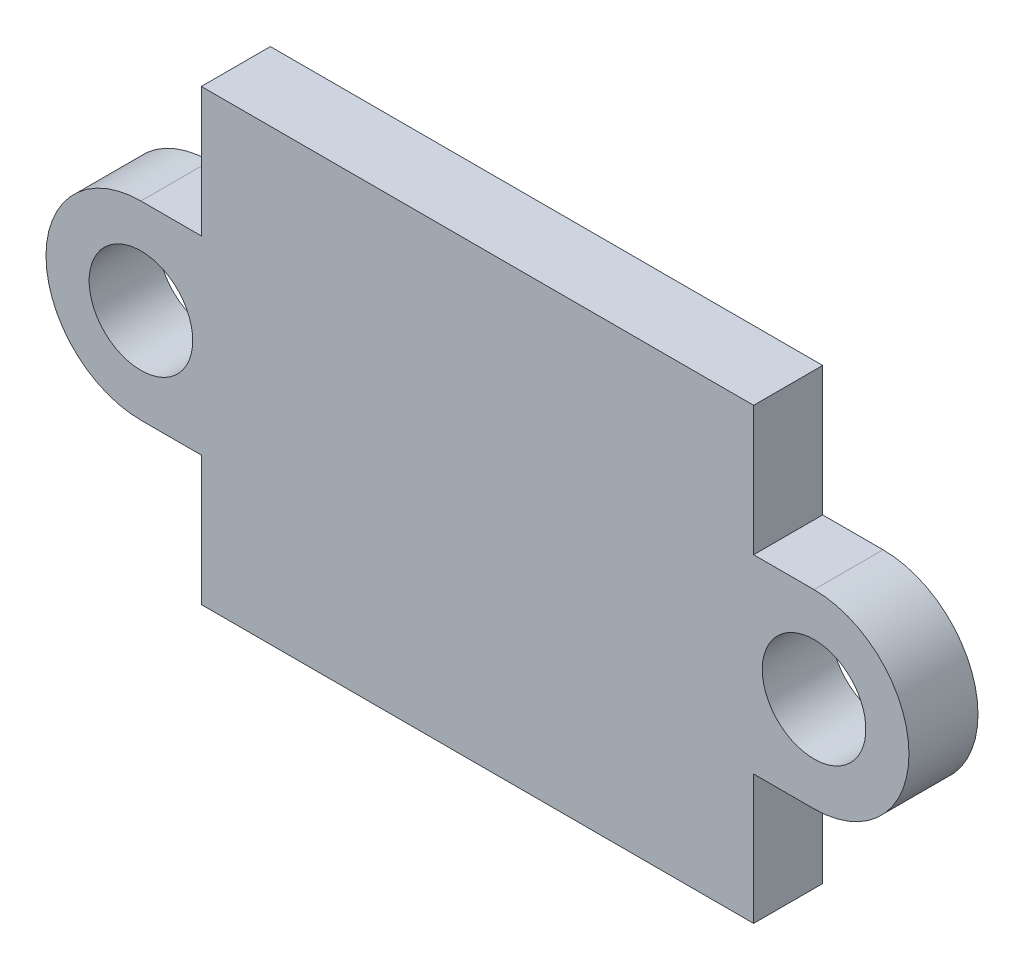
ISO-10303-21;
HEADER;
FILE_DESCRIPTION(('STEP AP214'),'2;1');
FILE_NAME('part.step','',(''),(''),'','','');
FILE_SCHEMA(('AUTOMOTIVE_DESIGN { 1 0 10303 214 1 1 1 1 }'));
ENDSEC;
DATA;
#1=APPLICATION_CONTEXT('core data for automotive mechanical design processes');
#2=APPLICATION_PROTOCOL_DEFINITION('international standard','automotive_design',2000,#1);
#3=PRODUCT_CONTEXT('',#1,'mechanical');
#4=PRODUCT('Part','Part','',(#3));
#5=PRODUCT_RELATED_PRODUCT_CATEGORY('part','',(#4));
#6=PRODUCT_DEFINITION_FORMATION('','',#4);
#7=PRODUCT_DEFINITION_CONTEXT('part definition',#1,'design');
#8=PRODUCT_DEFINITION('design','',#6,#7);
#9=PRODUCT_DEFINITION_SHAPE('','',#8);
#10=(LENGTH_UNIT() NAMED_UNIT(*) SI_UNIT(.MILLI.,.METRE.));
#11=(NAMED_UNIT(*) PLANE_ANGLE_UNIT() SI_UNIT($,.RADIAN.));
#12=(NAMED_UNIT(*) SI_UNIT($,.STERADIAN.) SOLID_ANGLE_UNIT());
#13=UNCERTAINTY_MEASURE_WITH_UNIT(LENGTH_MEASURE(1.E-05),#10,'distance_accuracy_value','');
#14=(GEOMETRIC_REPRESENTATION_CONTEXT(3) GLOBAL_UNCERTAINTY_ASSIGNED_CONTEXT((#13)) GLOBAL_UNIT_ASSIGNED_CONTEXT((#10,
#11,#12)) REPRESENTATION_CONTEXT('',''));
#15=CARTESIAN_POINT('',(0.,0.,0.));
#16=DIRECTION('',(0.,0.,1.));
#17=DIRECTION('',(1.,0.,0.));
#18=AXIS2_PLACEMENT_3D('',#15,#16,#17);
#19=CARTESIAN_POINT('',(-7.99999999999997,-6.50000000000001,1.));
#20=DIRECTION('',(1.,0.,0.));
#21=DIRECTION('',(0.,0.,-1.));
#22=AXIS2_PLACEMENT_3D('',#19,#20,#21);
#23=PLANE('',#22);
#24=DIRECTION('',(0.,0.,-1.));
#25=VECTOR('',#24,1.);
#26=CARTESIAN_POINT('',(-7.99999999999997,2.75,1.));
#27=LINE('',#26,#25);
#28=CARTESIAN_POINT('',(-7.99999999999997,2.75,1.));
#29=VERTEX_POINT('',#28);
#30=CARTESIAN_POINT('',(-7.99999999999997,2.75,-1.));
#31=VERTEX_POINT('',#30);
#32=EDGE_CURVE('E156',#29,#31,#27,.T.);
#33=ORIENTED_EDGE('',*,*,#32,.F.);
#34=DIRECTION('',(0.,-1.,0.));
#35=VECTOR('',#34,1.);
#36=CARTESIAN_POINT('',(-7.99999999999997,-6.50000000000001,1.));
#37=LINE('',#36,#35);
#38=CARTESIAN_POINT('',(-7.99999999999997,6.49999999999998,1.));
#39=VERTEX_POINT('',#38);
#40=EDGE_CURVE('E185',#39,#29,#37,.T.);
#41=ORIENTED_EDGE('',*,*,#40,.F.);
#42=DIRECTION('',(0.,0.,-1.));
#43=VECTOR('',#42,1.);
#44=CARTESIAN_POINT('',(-7.99999999999997,6.49999999999998,1.));
#45=LINE('',#44,#43);
#46=CARTESIAN_POINT('',(-7.99999999999997,6.49999999999998,-1.));
#47=VERTEX_POINT('',#46);
#48=EDGE_CURVE('E196',#39,#47,#45,.T.);
#49=ORIENTED_EDGE('',*,*,#48,.T.);
#50=DIRECTION('',(0.,-1.,0.));
#51=VECTOR('',#50,1.);
#52=CARTESIAN_POINT('',(-7.99999999999997,-6.50000000000001,-1.));
#53=LINE('',#52,#51);
#54=EDGE_CURVE('E197',#47,#31,#53,.T.);
#55=ORIENTED_EDGE('',*,*,#54,.T.);
#56=EDGE_LOOP('',(#33,#41,#49,#55));
#57=FACE_BOUND('',#56,.T.);
#58=ADVANCED_FACE('F39',(#57),#23,.F.);
#59=CARTESIAN_POINT('',(8.00000000000003,-6.50000000000001,1.));
#60=DIRECTION('',(-1.,0.,0.));
#61=DIRECTION('',(0.,0.,1.));
#62=AXIS2_PLACEMENT_3D('',#59,#60,#61);
#63=PLANE('',#62);
#64=DIRECTION('',(0.,0.,-1.));
#65=VECTOR('',#64,1.);
#66=CARTESIAN_POINT('',(7.99999999999997,-2.75,1.));
#67=LINE('',#66,#65);
#68=CARTESIAN_POINT('',(7.99999999999997,-2.75,1.));
#69=VERTEX_POINT('',#68);
#70=CARTESIAN_POINT('',(7.99999999999997,-2.75,-1.));
#71=VERTEX_POINT('',#70);
#72=EDGE_CURVE('E178',#69,#71,#67,.T.);
#73=ORIENTED_EDGE('',*,*,#72,.F.);
#74=DIRECTION('',(0.,1.,0.));
#75=VECTOR('',#74,1.);
#76=CARTESIAN_POINT('',(8.00000000000003,-6.50000000000001,1.));
#77=LINE('',#76,#75);
#78=CARTESIAN_POINT('',(8.00000000000003,-6.50000000000001,1.));
#79=VERTEX_POINT('',#78);
#80=EDGE_CURVE('E191',#79,#69,#77,.T.);
#81=ORIENTED_EDGE('',*,*,#80,.F.);
#82=DIRECTION('',(0.,0.,-1.));
#83=VECTOR('',#82,1.);
#84=CARTESIAN_POINT('',(8.00000000000003,-6.50000000000001,1.));
#85=LINE('',#84,#83);
#86=CARTESIAN_POINT('',(8.00000000000003,-6.50000000000001,-1.));
#87=VERTEX_POINT('',#86);
#88=EDGE_CURVE('E47',#79,#87,#85,.T.);
#89=ORIENTED_EDGE('',*,*,#88,.T.);
#90=DIRECTION('',(0.,1.,0.));
#91=VECTOR('',#90,1.);
#92=CARTESIAN_POINT('',(8.00000000000003,-6.50000000000001,-1.));
#93=LINE('',#92,#91);
#94=EDGE_CURVE('E203',#87,#71,#93,.T.);
#95=ORIENTED_EDGE('',*,*,#94,.T.);
#96=EDGE_LOOP('',(#73,#81,#89,#95));
#97=FACE_BOUND('',#96,.T.);
#98=ADVANCED_FACE('F218',(#97),#63,.F.);
#99=CARTESIAN_POINT('',(-7.99999999999997,-2.75,1.));
#100=VERTEX_POINT('',#99);
#101=CARTESIAN_POINT('',(-7.99999999999997,-6.50000000000001,1.));
#102=VERTEX_POINT('',#101);
#103=EDGE_CURVE('E188',#100,#102,#37,.T.);
#104=ORIENTED_EDGE('',*,*,#103,.F.);
#105=DIRECTION('',(0.,0.,-1.));
#106=VECTOR('',#105,1.);
#107=CARTESIAN_POINT('',(-7.99999999999997,-2.75,1.));
#108=LINE('',#107,#106);
#109=CARTESIAN_POINT('',(-7.99999999999997,-2.75,-1.));
#110=VERTEX_POINT('',#109);
#111=EDGE_CURVE('E133',#100,#110,#108,.T.);
#112=ORIENTED_EDGE('',*,*,#111,.T.);
#113=CARTESIAN_POINT('',(-7.99999999999997,-6.50000000000001,-1.));
#114=VERTEX_POINT('',#113);
#115=EDGE_CURVE('E184',#110,#114,#53,.T.);
#116=ORIENTED_EDGE('',*,*,#115,.T.);
#117=DIRECTION('',(0.,0.,-1.));
#118=VECTOR('',#117,1.);
#119=CARTESIAN_POINT('',(-7.99999999999997,-6.50000000000001,1.));
#120=LINE('',#119,#118);
#121=EDGE_CURVE('E11',#102,#114,#120,.T.);
#122=ORIENTED_EDGE('',*,*,#121,.F.);
#123=EDGE_LOOP('',(#104,#112,#116,#122));
#124=FACE_BOUND('',#123,.T.);
#125=ADVANCED_FACE('F41',(#124),#23,.F.);
#126=CARTESIAN_POINT('',(8.00000000000003,-6.50000000000001,1.));
#127=DIRECTION('',(0.,1.,0.));
#128=DIRECTION('',(0.,0.,1.));
#129=AXIS2_PLACEMENT_3D('',#126,#127,#128);
#130=PLANE('',#129);
#131=DIRECTION('',(1.,0.,0.));
#132=VECTOR('',#131,1.);
#133=CARTESIAN_POINT('',(8.00000000000003,-6.50000000000001,-1.));
#134=LINE('',#133,#132);
#135=EDGE_CURVE('E200',#114,#87,#134,.T.);
#136=ORIENTED_EDGE('',*,*,#135,.T.);
#137=ORIENTED_EDGE('',*,*,#88,.F.);
#138=DIRECTION('',(1.,0.,0.));
#139=VECTOR('',#138,1.);
#140=CARTESIAN_POINT('',(8.00000000000003,-6.50000000000001,1.));
#141=LINE('',#140,#139);
#142=EDGE_CURVE('E187',#102,#79,#141,.T.);
#143=ORIENTED_EDGE('',*,*,#142,.F.);
#144=ORIENTED_EDGE('',*,*,#121,.T.);
#145=EDGE_LOOP('',(#136,#137,#143,#144));
#146=FACE_BOUND('',#145,.T.);
#147=ADVANCED_FACE('F237',(#146),#130,.F.);
#148=CARTESIAN_POINT('',(7.99999999999997,2.75,1.));
#149=VERTEX_POINT('',#148);
#150=CARTESIAN_POINT('',(8.00000000000003,6.49999999999998,1.));
#151=VERTEX_POINT('',#150);
#152=EDGE_CURVE('E190',#149,#151,#77,.T.);
#153=ORIENTED_EDGE('',*,*,#152,.F.);
#154=DIRECTION('',(0.,0.,-1.));
#155=VECTOR('',#154,1.);
#156=CARTESIAN_POINT('',(7.99999999999997,2.75,1.));
#157=LINE('',#156,#155);
#158=CARTESIAN_POINT('',(8.00000000000003,2.75,-1.));
#159=VERTEX_POINT('',#158);
#160=EDGE_CURVE('E180',#149,#159,#157,.T.);
#161=ORIENTED_EDGE('',*,*,#160,.T.);
#162=CARTESIAN_POINT('',(8.00000000000003,6.49999999999998,-1.));
#163=VERTEX_POINT('',#162);
#164=EDGE_CURVE('E202',#159,#163,#93,.T.);
#165=ORIENTED_EDGE('',*,*,#164,.T.);
#166=DIRECTION('',(0.,0.,-1.));
#167=VECTOR('',#166,1.);
#168=CARTESIAN_POINT('',(8.00000000000003,6.49999999999998,1.));
#169=LINE('',#168,#167);
#170=EDGE_CURVE('E210',#151,#163,#169,.T.);
#171=ORIENTED_EDGE('',*,*,#170,.F.);
#172=EDGE_LOOP('',(#153,#161,#165,#171));
#173=FACE_BOUND('',#172,.T.);
#174=ADVANCED_FACE('F261',(#173),#63,.F.);
#175=CARTESIAN_POINT('',(8.00000000000003,6.49999999999998,1.));
#176=DIRECTION('',(0.,-1.,0.));
#177=DIRECTION('',(1.,0.,0.));
#178=AXIS2_PLACEMENT_3D('',#175,#176,#177);
#179=PLANE('',#178);
#180=DIRECTION('',(-1.,0.,0.));
#181=VECTOR('',#180,1.);
#182=CARTESIAN_POINT('',(8.00000000000003,6.49999999999998,-1.));
#183=LINE('',#182,#181);
#184=EDGE_CURVE('E206',#163,#47,#183,.T.);
#185=ORIENTED_EDGE('',*,*,#184,.T.);
#186=ORIENTED_EDGE('',*,*,#48,.F.);
#187=DIRECTION('',(-1.,0.,0.));
#188=VECTOR('',#187,1.);
#189=CARTESIAN_POINT('',(8.00000000000003,6.49999999999998,1.));
#190=LINE('',#189,#188);
#191=EDGE_CURVE('E194',#151,#39,#190,.T.);
#192=ORIENTED_EDGE('',*,*,#191,.F.);
#193=ORIENTED_EDGE('',*,*,#170,.T.);
#194=EDGE_LOOP('',(#185,#186,#192,#193));
#195=FACE_BOUND('',#194,.T.);
#196=ADVANCED_FACE('F256',(#195),#179,.F.);
#197=CARTESIAN_POINT('',(0.,0.,1.));
#198=DIRECTION('',(0.,0.,1.));
#199=DIRECTION('',(1.,0.,0.));
#200=AXIS2_PLACEMENT_3D('',#197,#198,#199);
#201=PLANE('',#200);
#202=ORIENTED_EDGE('',*,*,#40,.T.);
#203=DIRECTION('',(-1.,0.,0.));
#204=VECTOR('',#203,1.);
#205=CARTESIAN_POINT('',(-9.75,2.75,1.));
#206=LINE('',#205,#204);
#207=CARTESIAN_POINT('',(-9.75,2.75,1.));
#208=VERTEX_POINT('',#207);
#209=EDGE_CURVE('E136',#29,#208,#206,.T.);
#210=ORIENTED_EDGE('',*,*,#209,.T.);
#211=CARTESIAN_POINT('',(-9.75,0.,1.));
#212=DIRECTION('',(0.,0.,1.));
#213=DIRECTION('',(1.,0.,0.));
#214=AXIS2_PLACEMENT_3D('',#211,#212,#213);
#215=CIRCLE('',#214,2.75);
#216=CARTESIAN_POINT('',(-9.75,-2.75,1.));
#217=VERTEX_POINT('',#216);
#218=EDGE_CURVE('E137',#208,#217,#215,.T.);
#219=ORIENTED_EDGE('',*,*,#218,.T.);
#220=DIRECTION('',(1.,0.,0.));
#221=VECTOR('',#220,1.);
#222=CARTESIAN_POINT('',(-9.75,-2.75,1.));
#223=LINE('',#222,#221);
#224=EDGE_CURVE('E127',#217,#100,#223,.T.);
#225=ORIENTED_EDGE('',*,*,#224,.T.);
#226=ORIENTED_EDGE('',*,*,#103,.T.);
#227=ORIENTED_EDGE('',*,*,#142,.T.);
#228=ORIENTED_EDGE('',*,*,#80,.T.);
#229=DIRECTION('',(1.,0.,0.));
#230=VECTOR('',#229,1.);
#231=CARTESIAN_POINT('',(9.75,-2.75,1.));
#232=LINE('',#231,#230);
#233=CARTESIAN_POINT('',(9.75,-2.75,1.));
#234=VERTEX_POINT('',#233);
#235=EDGE_CURVE('E169',#69,#234,#232,.T.);
#236=ORIENTED_EDGE('',*,*,#235,.T.);
#237=CARTESIAN_POINT('',(9.75,0.,1.));
#238=DIRECTION('',(0.,0.,1.));
#239=DIRECTION('',(-1.,0.,0.));
#240=AXIS2_PLACEMENT_3D('',#237,#238,#239);
#241=CIRCLE('',#240,2.75);
#242=CARTESIAN_POINT('',(9.75,2.75,1.));
#243=VERTEX_POINT('',#242);
#244=EDGE_CURVE('E163',#234,#243,#241,.T.);
#245=ORIENTED_EDGE('',*,*,#244,.T.);
#246=DIRECTION('',(-1.,0.,0.));
#247=VECTOR('',#246,1.);
#248=CARTESIAN_POINT('',(9.75,2.75,1.));
#249=LINE('',#248,#247);
#250=EDGE_CURVE('E166',#243,#149,#249,.T.);
#251=ORIENTED_EDGE('',*,*,#250,.T.);
#252=ORIENTED_EDGE('',*,*,#152,.T.);
#253=ORIENTED_EDGE('',*,*,#191,.T.);
#254=EDGE_LOOP('',(#202,#210,#219,#225,#226,#227,#228,#236,#245,#251,#252,#253));
#255=FACE_BOUND('',#254,.T.);
#256=CARTESIAN_POINT('',(9.75,0.,1.));
#257=DIRECTION('',(0.,0.,1.));
#258=DIRECTION('',(-1.,0.,0.));
#259=AXIS2_PLACEMENT_3D('',#256,#257,#258);
#260=CIRCLE('',#259,1.5);
#261=CARTESIAN_POINT('',(8.25,0.,1.));
#262=VERTEX_POINT('',#261);
#263=EDGE_CURVE('E154',#262,#262,#260,.T.);
#264=ORIENTED_EDGE('',*,*,#263,.F.);
#265=EDGE_LOOP('',(#264));
#266=FACE_BOUND('',#265,.T.);
#267=CARTESIAN_POINT('',(-9.75,0.,1.));
#268=DIRECTION('',(0.,0.,1.));
#269=DIRECTION('',(1.,0.,0.));
#270=AXIS2_PLACEMENT_3D('',#267,#268,#269);
#271=CIRCLE('',#270,1.5);
#272=CARTESIAN_POINT('',(-8.25,0.,1.));
#273=VERTEX_POINT('',#272);
#274=EDGE_CURVE('E242',#273,#273,#271,.T.);
#275=ORIENTED_EDGE('',*,*,#274,.F.);
#276=EDGE_LOOP('',(#275));
#277=FACE_BOUND('',#276,.T.);
#278=ADVANCED_FACE('F141',(#255,#266,#277),#201,.T.);
#279=CARTESIAN_POINT('',(0.,0.,-1.));
#280=DIRECTION('',(0.,0.,1.));
#281=DIRECTION('',(1.,0.,0.));
#282=AXIS2_PLACEMENT_3D('',#279,#280,#281);
#283=PLANE('',#282);
#284=ORIENTED_EDGE('',*,*,#54,.F.);
#285=ORIENTED_EDGE('',*,*,#184,.F.);
#286=ORIENTED_EDGE('',*,*,#164,.F.);
#287=DIRECTION('',(-1.,0.,0.));
#288=VECTOR('',#287,1.);
#289=CARTESIAN_POINT('',(9.75,2.75,-1.));
#290=LINE('',#289,#288);
#291=CARTESIAN_POINT('',(9.75,2.75,-1.));
#292=VERTEX_POINT('',#291);
#293=EDGE_CURVE('E62',#292,#159,#290,.T.);
#294=ORIENTED_EDGE('',*,*,#293,.F.);
#295=CARTESIAN_POINT('',(9.75,0.,-1.));
#296=DIRECTION('',(0.,0.,1.));
#297=DIRECTION('',(-1.,0.,0.));
#298=AXIS2_PLACEMENT_3D('',#295,#296,#297);
#299=CIRCLE('',#298,2.75);
#300=CARTESIAN_POINT('',(9.75,-2.75,-1.));
#301=VERTEX_POINT('',#300);
#302=EDGE_CURVE('E161',#301,#292,#299,.T.);
#303=ORIENTED_EDGE('',*,*,#302,.F.);
#304=DIRECTION('',(1.,0.,0.));
#305=VECTOR('',#304,1.);
#306=CARTESIAN_POINT('',(9.75,-2.75,-1.));
#307=LINE('',#306,#305);
#308=EDGE_CURVE('E167',#71,#301,#307,.T.);
#309=ORIENTED_EDGE('',*,*,#308,.F.);
#310=ORIENTED_EDGE('',*,*,#94,.F.);
#311=ORIENTED_EDGE('',*,*,#135,.F.);
#312=ORIENTED_EDGE('',*,*,#115,.F.);
#313=DIRECTION('',(1.,0.,0.));
#314=VECTOR('',#313,1.);
#315=CARTESIAN_POINT('',(-9.75,-2.75,-1.));
#316=LINE('',#315,#314);
#317=CARTESIAN_POINT('',(-9.75,-2.75,-1.));
#318=VERTEX_POINT('',#317);
#319=EDGE_CURVE('E54',#318,#110,#316,.T.);
#320=ORIENTED_EDGE('',*,*,#319,.F.);
#321=CARTESIAN_POINT('',(-9.75,0.,-1.));
#322=DIRECTION('',(0.,0.,1.));
#323=DIRECTION('',(1.,0.,0.));
#324=AXIS2_PLACEMENT_3D('',#321,#322,#323);
#325=CIRCLE('',#324,2.75);
#326=CARTESIAN_POINT('',(-9.75,2.75,-1.));
#327=VERTEX_POINT('',#326);
#328=EDGE_CURVE('E150',#327,#318,#325,.T.);
#329=ORIENTED_EDGE('',*,*,#328,.F.);
#330=DIRECTION('',(-1.,0.,0.));
#331=VECTOR('',#330,1.);
#332=CARTESIAN_POINT('',(-9.75,2.75,-1.));
#333=LINE('',#332,#331);
#334=EDGE_CURVE('E146',#31,#327,#333,.T.);
#335=ORIENTED_EDGE('',*,*,#334,.F.);
#336=EDGE_LOOP('',(#284,#285,#286,#294,#303,#309,#310,#311,#312,#320,#329,#335));
#337=FACE_BOUND('',#336,.T.);
#338=CARTESIAN_POINT('',(9.75,0.,-1.));
#339=DIRECTION('',(0.,0.,1.));
#340=DIRECTION('',(-1.,0.,0.));
#341=AXIS2_PLACEMENT_3D('',#338,#339,#340);
#342=CIRCLE('',#341,1.5);
#343=CARTESIAN_POINT('',(8.25,0.,-1.));
#344=VERTEX_POINT('',#343);
#345=EDGE_CURVE('E151',#344,#344,#342,.T.);
#346=ORIENTED_EDGE('',*,*,#345,.T.);
#347=EDGE_LOOP('',(#346));
#348=FACE_BOUND('',#347,.T.);
#349=CARTESIAN_POINT('',(-9.75,0.,-1.));
#350=DIRECTION('',(0.,0.,1.));
#351=DIRECTION('',(1.,0.,0.));
#352=AXIS2_PLACEMENT_3D('',#349,#350,#351);
#353=CIRCLE('',#352,1.5);
#354=CARTESIAN_POINT('',(-8.25,0.,-1.));
#355=VERTEX_POINT('',#354);
#356=EDGE_CURVE('E439',#355,#355,#353,.T.);
#357=ORIENTED_EDGE('',*,*,#356,.T.);
#358=EDGE_LOOP('',(#357));
#359=FACE_BOUND('',#358,.T.);
#360=ADVANCED_FACE('F225',(#337,#348,#359),#283,.F.);
#361=CARTESIAN_POINT('',(9.75,0.,1.));
#362=DIRECTION('',(0.,0.,-1.));
#363=DIRECTION('',(-1.,0.,0.));
#364=AXIS2_PLACEMENT_3D('',#361,#362,#363);
#365=CYLINDRICAL_SURFACE('',#364,2.75);
#366=ORIENTED_EDGE('',*,*,#302,.T.);
#367=DIRECTION('',(0.,0.,-1.));
#368=VECTOR('',#367,1.);
#369=CARTESIAN_POINT('',(9.75,2.75,1.));
#370=LINE('',#369,#368);
#371=EDGE_CURVE('E182',#243,#292,#370,.T.);
#372=ORIENTED_EDGE('',*,*,#371,.F.);
#373=ORIENTED_EDGE('',*,*,#244,.F.);
#374=DIRECTION('',(0.,0.,-1.));
#375=VECTOR('',#374,1.);
#376=CARTESIAN_POINT('',(9.75,-2.75,1.));
#377=LINE('',#376,#375);
#378=EDGE_CURVE('E171',#234,#301,#377,.T.);
#379=ORIENTED_EDGE('',*,*,#378,.T.);
#380=EDGE_LOOP('',(#366,#372,#373,#379));
#381=FACE_BOUND('',#380,.T.);
#382=ADVANCED_FACE('F234',(#381),#365,.T.);
#383=CARTESIAN_POINT('',(9.75,2.75,1.));
#384=DIRECTION('',(0.,-1.,0.));
#385=DIRECTION('',(1.,0.,0.));
#386=AXIS2_PLACEMENT_3D('',#383,#384,#385);
#387=PLANE('',#386);
#388=ORIENTED_EDGE('',*,*,#293,.T.);
#389=ORIENTED_EDGE('',*,*,#160,.F.);
#390=ORIENTED_EDGE('',*,*,#250,.F.);
#391=ORIENTED_EDGE('',*,*,#371,.T.);
#392=EDGE_LOOP('',(#388,#389,#390,#391));
#393=FACE_BOUND('',#392,.T.);
#394=ADVANCED_FACE('F262',(#393),#387,.F.);
#395=CARTESIAN_POINT('',(9.75,-2.75,1.));
#396=DIRECTION('',(0.,1.,0.));
#397=DIRECTION('',(-1.,0.,0.));
#398=AXIS2_PLACEMENT_3D('',#395,#396,#397);
#399=PLANE('',#398);
#400=ORIENTED_EDGE('',*,*,#308,.T.);
#401=ORIENTED_EDGE('',*,*,#378,.F.);
#402=ORIENTED_EDGE('',*,*,#235,.F.);
#403=ORIENTED_EDGE('',*,*,#72,.T.);
#404=EDGE_LOOP('',(#400,#401,#402,#403));
#405=FACE_BOUND('',#404,.T.);
#406=ADVANCED_FACE('F231',(#405),#399,.F.);
#407=CARTESIAN_POINT('',(9.75,0.,1.));
#408=DIRECTION('',(0.,0.,-1.));
#409=DIRECTION('',(-1.,0.,0.));
#410=AXIS2_PLACEMENT_3D('',#407,#408,#409);
#411=CYLINDRICAL_SURFACE('',#410,1.5);
#412=ORIENTED_EDGE('',*,*,#263,.T.);
#413=EDGE_LOOP('',(#412));
#414=FACE_BOUND('',#413,.T.);
#415=ORIENTED_EDGE('',*,*,#345,.F.);
#416=EDGE_LOOP('',(#415));
#417=FACE_BOUND('',#416,.T.);
#418=ADVANCED_FACE('F269',(#414,#417),#411,.F.);
#419=CARTESIAN_POINT('',(-9.75,0.,1.));
#420=DIRECTION('',(0.,0.,-1.));
#421=DIRECTION('',(-1.,0.,0.));
#422=AXIS2_PLACEMENT_3D('',#419,#420,#421);
#423=CYLINDRICAL_SURFACE('',#422,2.75);
#424=ORIENTED_EDGE('',*,*,#328,.T.);
#425=DIRECTION('',(0.,0.,-1.));
#426=VECTOR('',#425,1.);
#427=CARTESIAN_POINT('',(-9.75,-2.75,1.));
#428=LINE('',#427,#426);
#429=EDGE_CURVE('E131',#217,#318,#428,.T.);
#430=ORIENTED_EDGE('',*,*,#429,.F.);
#431=ORIENTED_EDGE('',*,*,#218,.F.);
#432=DIRECTION('',(0.,0.,-1.));
#433=VECTOR('',#432,1.);
#434=CARTESIAN_POINT('',(-9.75,2.75,1.));
#435=LINE('',#434,#433);
#436=EDGE_CURVE('E246',#208,#327,#435,.T.);
#437=ORIENTED_EDGE('',*,*,#436,.T.);
#438=EDGE_LOOP('',(#424,#430,#431,#437));
#439=FACE_BOUND('',#438,.T.);
#440=ADVANCED_FACE('F148',(#439),#423,.T.);
#441=CARTESIAN_POINT('',(-9.75,-2.75,1.));
#442=DIRECTION('',(0.,1.,0.));
#443=DIRECTION('',(-1.,0.,0.));
#444=AXIS2_PLACEMENT_3D('',#441,#442,#443);
#445=PLANE('',#444);
#446=ORIENTED_EDGE('',*,*,#319,.T.);
#447=ORIENTED_EDGE('',*,*,#111,.F.);
#448=ORIENTED_EDGE('',*,*,#224,.F.);
#449=ORIENTED_EDGE('',*,*,#429,.T.);
#450=EDGE_LOOP('',(#446,#447,#448,#449));
#451=FACE_BOUND('',#450,.T.);
#452=ADVANCED_FACE('F129',(#451),#445,.F.);
#453=CARTESIAN_POINT('',(-9.75,2.75,1.));
#454=DIRECTION('',(0.,-1.,0.));
#455=DIRECTION('',(1.,0.,0.));
#456=AXIS2_PLACEMENT_3D('',#453,#454,#455);
#457=PLANE('',#456);
#458=ORIENTED_EDGE('',*,*,#334,.T.);
#459=ORIENTED_EDGE('',*,*,#436,.F.);
#460=ORIENTED_EDGE('',*,*,#209,.F.);
#461=ORIENTED_EDGE('',*,*,#32,.T.);
#462=EDGE_LOOP('',(#458,#459,#460,#461));
#463=FACE_BOUND('',#462,.T.);
#464=ADVANCED_FACE('F249',(#463),#457,.F.);
#465=CARTESIAN_POINT('',(-9.75,0.,1.));
#466=DIRECTION('',(0.,0.,-1.));
#467=DIRECTION('',(-1.,0.,0.));
#468=AXIS2_PLACEMENT_3D('',#465,#466,#467);
#469=CYLINDRICAL_SURFACE('',#468,1.5);
#470=ORIENTED_EDGE('',*,*,#274,.T.);
#471=EDGE_LOOP('',(#470));
#472=FACE_BOUND('',#471,.T.);
#473=ORIENTED_EDGE('',*,*,#356,.F.);
#474=EDGE_LOOP('',(#473));
#475=FACE_BOUND('',#474,.T.);
#476=ADVANCED_FACE('F357',(#472,#475),#469,.F.);
#477=CLOSED_SHELL('',(#58,#98,#125,#147,#174,#196,#278,#360,#382,#394,#406,#418,#440,#452,#464,#476));
#478=MANIFOLD_SOLID_BREP('B2',#477);
#479=ADVANCED_BREP_SHAPE_REPRESENTATION('',(#18,#478),#14);
#480=SHAPE_DEFINITION_REPRESENTATION(#9,#479);
ENDSEC;
END-ISO-10303-21;
